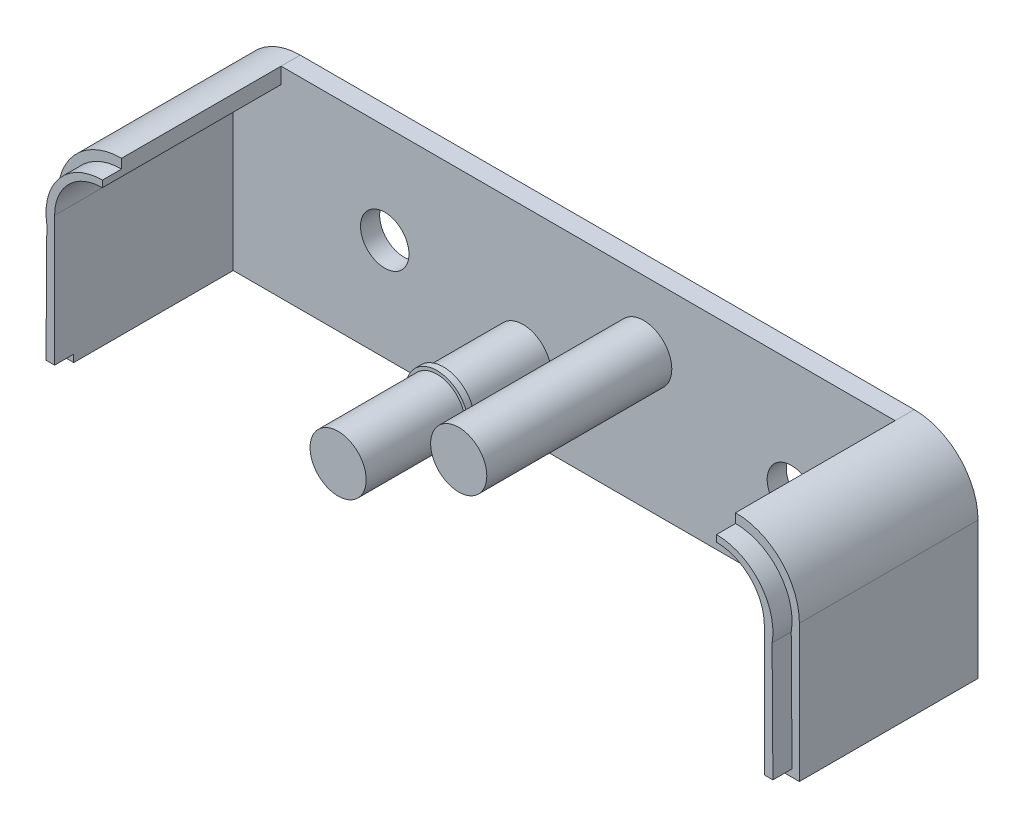
ISO-10303-21;
HEADER;
FILE_DESCRIPTION(('STEP AP214'),'2;1');
FILE_NAME('part.step','',(''),(''),'','','');
FILE_SCHEMA(('AUTOMOTIVE_DESIGN { 1 0 10303 214 1 1 1 1 }'));
ENDSEC;
DATA;
#1=APPLICATION_CONTEXT('core data for automotive mechanical design processes');
#2=APPLICATION_PROTOCOL_DEFINITION('international standard','automotive_design',2000,#1);
#3=PRODUCT_CONTEXT('',#1,'mechanical');
#4=PRODUCT('Part','Part','',(#3));
#5=PRODUCT_RELATED_PRODUCT_CATEGORY('part','',(#4));
#6=PRODUCT_DEFINITION_FORMATION('','',#4);
#7=PRODUCT_DEFINITION_CONTEXT('part definition',#1,'design');
#8=PRODUCT_DEFINITION('design','',#6,#7);
#9=PRODUCT_DEFINITION_SHAPE('','',#8);
#10=(LENGTH_UNIT() NAMED_UNIT(*) SI_UNIT(.MILLI.,.METRE.));
#11=(NAMED_UNIT(*) PLANE_ANGLE_UNIT() SI_UNIT($,.RADIAN.));
#12=(NAMED_UNIT(*) SI_UNIT($,.STERADIAN.) SOLID_ANGLE_UNIT());
#13=UNCERTAINTY_MEASURE_WITH_UNIT(LENGTH_MEASURE(1.E-05),#10,'distance_accuracy_value','');
#14=(GEOMETRIC_REPRESENTATION_CONTEXT(3) GLOBAL_UNCERTAINTY_ASSIGNED_CONTEXT((#13)) GLOBAL_UNIT_ASSIGNED_CONTEXT((#10,
#11,#12)) REPRESENTATION_CONTEXT('',''));
#15=CARTESIAN_POINT('',(0.,0.,0.));
#16=DIRECTION('',(0.,0.,1.));
#17=DIRECTION('',(1.,0.,0.));
#18=AXIS2_PLACEMENT_3D('',#15,#16,#17);
#19=CARTESIAN_POINT('',(-10.185,-4.75,28.));
#20=DIRECTION('',(0.,0.,-1.));
#21=DIRECTION('',(-1.,0.,0.));
#22=AXIS2_PLACEMENT_3D('',#19,#20,#21);
#23=CYLINDRICAL_SURFACE('',#22,4.4);
#24=CARTESIAN_POINT('',(-10.185,-4.75,3.));
#25=DIRECTION('',(0.,0.,1.));
#26=DIRECTION('',(1.,0.,0.));
#27=AXIS2_PLACEMENT_3D('',#24,#25,#26);
#28=CIRCLE('',#27,4.4);
#29=CARTESIAN_POINT('',(-5.785,-4.75,3.));
#30=VERTEX_POINT('',#29);
#31=EDGE_CURVE('E267',#30,#30,#28,.T.);
#32=ORIENTED_EDGE('',*,*,#31,.T.);
#33=EDGE_LOOP('',(#32));
#34=FACE_BOUND('',#33,.T.);
#35=CARTESIAN_POINT('',(-10.185,-4.75,15.5));
#36=DIRECTION('',(0.,0.,1.));
#37=DIRECTION('',(1.,0.,0.));
#38=AXIS2_PLACEMENT_3D('',#35,#36,#37);
#39=CIRCLE('',#38,4.4);
#40=CARTESIAN_POINT('',(-5.785,-4.75,15.5));
#41=VERTEX_POINT('',#40);
#42=EDGE_CURVE('E11',#41,#41,#39,.T.);
#43=ORIENTED_EDGE('',*,*,#42,.F.);
#44=EDGE_LOOP('',(#43));
#45=FACE_BOUND('',#44,.T.);
#46=ADVANCED_FACE('F41',(#34,#45),#23,.T.);
#47=CARTESIAN_POINT('',(0.,0.,28.));
#48=DIRECTION('',(0.,0.,1.));
#49=DIRECTION('',(1.,0.,0.));
#50=AXIS2_PLACEMENT_3D('',#47,#48,#49);
#51=PLANE('',#50);
#52=DIRECTION('',(-0.00691231713860875,0.999976109650513,0.));
#53=VECTOR('',#52,1.);
#54=CARTESIAN_POINT('',(56.8468788897479,3.93474700667868,28.));
#55=LINE('',#54,#53);
#56=CARTESIAN_POINT('',(56.975,-14.6,28.));
#57=VERTEX_POINT('',#56);
#58=CARTESIAN_POINT('',(56.8468788897479,3.93474700667868,28.));
#59=VERTEX_POINT('',#58);
#60=EDGE_CURVE('E251',#57,#59,#55,.T.);
#61=ORIENTED_EDGE('',*,*,#60,.F.);
#62=DIRECTION('',(1.,0.,0.));
#63=VECTOR('',#62,1.);
#64=CARTESIAN_POINT('',(55.625,-14.6,28.));
#65=LINE('',#64,#63);
#66=CARTESIAN_POINT('',(55.625,-14.6,28.));
#67=VERTEX_POINT('',#66);
#68=EDGE_CURVE('E228',#67,#57,#65,.T.);
#69=ORIENTED_EDGE('',*,*,#68,.F.);
#70=DIRECTION('',(0.,1.,0.));
#71=VECTOR('',#70,1.);
#72=CARTESIAN_POINT('',(55.625,0.,28.));
#73=LINE('',#72,#71);
#74=CARTESIAN_POINT('',(55.625,-15.75,28.));
#75=VERTEX_POINT('',#74);
#76=EDGE_CURVE('E272',#75,#67,#73,.T.);
#77=ORIENTED_EDGE('',*,*,#76,.F.);
#78=DIRECTION('',(1.,0.,0.));
#79=VECTOR('',#78,1.);
#80=CARTESIAN_POINT('',(0.,-15.75,28.));
#81=LINE('',#80,#79);
#82=CARTESIAN_POINT('',(58.125,-15.75,28.));
#83=VERTEX_POINT('',#82);
#84=EDGE_CURVE('E275',#75,#83,#81,.T.);
#85=ORIENTED_EDGE('',*,*,#84,.T.);
#86=DIRECTION('',(0.,1.,0.));
#87=VECTOR('',#86,1.);
#88=CARTESIAN_POINT('',(58.125,0.,28.));
#89=LINE('',#88,#87);
#90=CARTESIAN_POINT('',(58.125,5.75,28.));
#91=VERTEX_POINT('',#90);
#92=EDGE_CURVE('E279',#83,#91,#89,.T.);
#93=ORIENTED_EDGE('',*,*,#92,.T.);
#94=CARTESIAN_POINT('',(48.125,5.75,28.));
#95=DIRECTION('',(0.,0.,1.));
#96=DIRECTION('',(1.,0.,0.));
#97=AXIS2_PLACEMENT_3D('',#94,#95,#96);
#98=CIRCLE('',#97,10.);
#99=CARTESIAN_POINT('',(48.125,15.75,28.));
#100=VERTEX_POINT('',#99);
#101=EDGE_CURVE('E282',#91,#100,#98,.T.);
#102=ORIENTED_EDGE('',*,*,#101,.T.);
#103=DIRECTION('',(0.,1.,0.));
#104=VECTOR('',#103,1.);
#105=CARTESIAN_POINT('',(48.125,0.,28.));
#106=LINE('',#105,#104);
#107=CARTESIAN_POINT('',(48.125,14.2851898188413,28.));
#108=VERTEX_POINT('',#107);
#109=EDGE_CURVE('E285',#108,#100,#106,.T.);
#110=ORIENTED_EDGE('',*,*,#109,.F.);
#111=CARTESIAN_POINT('',(48.125,5.43518981884131,28.));
#112=DIRECTION('',(0.,0.,1.));
#113=DIRECTION('',(-1.,0.,0.));
#114=AXIS2_PLACEMENT_3D('',#111,#112,#113);
#115=CIRCLE('',#114,8.85);
#116=EDGE_CURVE('E249',#59,#108,#115,.T.);
#117=ORIENTED_EDGE('',*,*,#116,.F.);
#118=EDGE_LOOP('',(#61,#69,#77,#85,#93,#102,#110,#117));
#119=FACE_BOUND('',#118,.T.);
#120=ADVANCED_FACE('F407',(#119),#51,.T.);
#121=CARTESIAN_POINT('',(0.,0.,28.));
#122=DIRECTION('',(0.,0.,1.));
#123=DIRECTION('',(1.,0.,0.));
#124=AXIS2_PLACEMENT_3D('',#121,#122,#123);
#125=PLANE('',#124);
#126=DIRECTION('',(-0.006912317138608,-0.999976109650513,0.));
#127=VECTOR('',#126,1.);
#128=CARTESIAN_POINT('',(-56.8468788897479,3.93474700667866,28.));
#129=LINE('',#128,#127);
#130=CARTESIAN_POINT('',(-56.8468788897479,3.93474700667866,28.));
#131=VERTEX_POINT('',#130);
#132=CARTESIAN_POINT('',(-56.975,-14.6,28.));
#133=VERTEX_POINT('',#132);
#134=EDGE_CURVE('E214',#131,#133,#129,.T.);
#135=ORIENTED_EDGE('',*,*,#134,.F.);
#136=CARTESIAN_POINT('',(-48.125,5.4351898188413,28.));
#137=DIRECTION('',(0.,0.,1.));
#138=DIRECTION('',(1.,0.,0.));
#139=AXIS2_PLACEMENT_3D('',#136,#137,#138);
#140=CIRCLE('',#139,8.85);
#141=CARTESIAN_POINT('',(-48.125,14.2851898188413,28.));
#142=VERTEX_POINT('',#141);
#143=EDGE_CURVE('E226',#142,#131,#140,.T.);
#144=ORIENTED_EDGE('',*,*,#143,.F.);
#145=DIRECTION('',(0.,1.,0.));
#146=VECTOR('',#145,1.);
#147=CARTESIAN_POINT('',(-48.125,0.,28.));
#148=LINE('',#147,#146);
#149=CARTESIAN_POINT('',(-48.125,15.75,28.));
#150=VERTEX_POINT('',#149);
#151=EDGE_CURVE('E302',#142,#150,#148,.T.);
#152=ORIENTED_EDGE('',*,*,#151,.T.);
#153=CARTESIAN_POINT('',(-48.125,5.75,28.));
#154=DIRECTION('',(0.,0.,1.));
#155=DIRECTION('',(1.,0.,0.));
#156=AXIS2_PLACEMENT_3D('',#153,#154,#155);
#157=CIRCLE('',#156,10.);
#158=CARTESIAN_POINT('',(-58.125,5.75,28.));
#159=VERTEX_POINT('',#158);
#160=EDGE_CURVE('E304',#150,#159,#157,.T.);
#161=ORIENTED_EDGE('',*,*,#160,.T.);
#162=DIRECTION('',(0.,-1.,0.));
#163=VECTOR('',#162,1.);
#164=CARTESIAN_POINT('',(-58.125,0.,28.));
#165=LINE('',#164,#163);
#166=CARTESIAN_POINT('',(-58.125,-15.75,28.));
#167=VERTEX_POINT('',#166);
#168=EDGE_CURVE('E308',#159,#167,#165,.T.);
#169=ORIENTED_EDGE('',*,*,#168,.T.);
#170=DIRECTION('',(1.,0.,0.));
#171=VECTOR('',#170,1.);
#172=CARTESIAN_POINT('',(0.,-15.75,28.));
#173=LINE('',#172,#171);
#174=CARTESIAN_POINT('',(-55.625,-15.75,28.));
#175=VERTEX_POINT('',#174);
#176=EDGE_CURVE('E311',#167,#175,#173,.T.);
#177=ORIENTED_EDGE('',*,*,#176,.T.);
#178=DIRECTION('',(0.,-1.,0.));
#179=VECTOR('',#178,1.);
#180=CARTESIAN_POINT('',(-55.625,0.,28.));
#181=LINE('',#180,#179);
#182=CARTESIAN_POINT('',(-55.625,-14.6,28.));
#183=VERTEX_POINT('',#182);
#184=EDGE_CURVE('E314',#183,#175,#181,.T.);
#185=ORIENTED_EDGE('',*,*,#184,.F.);
#186=DIRECTION('',(1.,0.,0.));
#187=VECTOR('',#186,1.);
#188=CARTESIAN_POINT('',(-55.625,-14.6,28.));
#189=LINE('',#188,#187);
#190=EDGE_CURVE('E212',#133,#183,#189,.T.);
#191=ORIENTED_EDGE('',*,*,#190,.F.);
#192=EDGE_LOOP('',(#135,#144,#152,#161,#169,#177,#185,#191));
#193=FACE_BOUND('',#192,.T.);
#194=ADVANCED_FACE('F422',(#193),#125,.T.);
#195=CARTESIAN_POINT('',(8.72499999999998,5.25,28.));
#196=DIRECTION('',(0.,0.,-1.));
#197=DIRECTION('',(-1.,0.,0.));
#198=AXIS2_PLACEMENT_3D('',#195,#196,#197);
#199=CYLINDRICAL_SURFACE('',#198,4.39999999999999);
#200=CARTESIAN_POINT('',(8.72499999999998,5.25,3.));
#201=DIRECTION('',(0.,0.,1.));
#202=DIRECTION('',(1.,0.,0.));
#203=AXIS2_PLACEMENT_3D('',#200,#201,#202);
#204=CIRCLE('',#203,4.39999999999999);
#205=CARTESIAN_POINT('',(13.125,5.25,3.));
#206=VERTEX_POINT('',#205);
#207=EDGE_CURVE('E270',#206,#206,#204,.T.);
#208=ORIENTED_EDGE('',*,*,#207,.T.);
#209=EDGE_LOOP('',(#208));
#210=FACE_BOUND('',#209,.T.);
#211=CARTESIAN_POINT('',(8.72499999999998,5.25,32.));
#212=DIRECTION('',(0.,0.,1.));
#213=DIRECTION('',(1.,0.,0.));
#214=AXIS2_PLACEMENT_3D('',#211,#212,#213);
#215=CIRCLE('',#214,4.39999999999999);
#216=CARTESIAN_POINT('',(13.125,5.25,32.));
#217=VERTEX_POINT('',#216);
#218=EDGE_CURVE('E217',#217,#217,#215,.T.);
#219=ORIENTED_EDGE('',*,*,#218,.F.);
#220=EDGE_LOOP('',(#219));
#221=FACE_BOUND('',#220,.T.);
#222=ADVANCED_FACE('F538',(#210,#221),#199,.T.);
#223=CARTESIAN_POINT('',(-48.125,5.75,3.));
#224=DIRECTION('',(0.,0.,1.));
#225=DIRECTION('',(1.,0.,0.));
#226=AXIS2_PLACEMENT_3D('',#223,#224,#225);
#227=PLANE('',#226);
#228=ORIENTED_EDGE('',*,*,#31,.F.);
#229=EDGE_LOOP('',(#228));
#230=FACE_BOUND('',#229,.T.);
#231=ORIENTED_EDGE('',*,*,#207,.F.);
#232=EDGE_LOOP('',(#231));
#233=FACE_BOUND('',#232,.T.);
#234=CARTESIAN_POINT('',(31.875,-2.25,3.));
#235=DIRECTION('',(0.,0.,1.));
#236=DIRECTION('',(1.,0.,0.));
#237=AXIS2_PLACEMENT_3D('',#234,#235,#236);
#238=CIRCLE('',#237,3.8);
#239=CARTESIAN_POINT('',(35.675,-2.25,3.));
#240=VERTEX_POINT('',#239);
#241=EDGE_CURVE('E336',#240,#240,#238,.T.);
#242=ORIENTED_EDGE('',*,*,#241,.F.);
#243=EDGE_LOOP('',(#242));
#244=FACE_BOUND('',#243,.T.);
#245=CARTESIAN_POINT('',(-48.125,5.75,3.));
#246=DIRECTION('',(0.,0.,1.));
#247=DIRECTION('',(1.,0.,0.));
#248=AXIS2_PLACEMENT_3D('',#245,#246,#247);
#249=CIRCLE('',#248,7.5);
#250=CARTESIAN_POINT('',(-48.125,13.25,3.));
#251=VERTEX_POINT('',#250);
#252=CARTESIAN_POINT('',(-55.625,5.75,3.));
#253=VERTEX_POINT('',#252);
#254=EDGE_CURVE('E194',#251,#253,#249,.T.);
#255=ORIENTED_EDGE('',*,*,#254,.T.);
#256=DIRECTION('',(0.,-1.,0.));
#257=VECTOR('',#256,1.);
#258=CARTESIAN_POINT('',(-55.625,0.,3.));
#259=LINE('',#258,#257);
#260=CARTESIAN_POINT('',(-55.625,-15.75,3.));
#261=VERTEX_POINT('',#260);
#262=EDGE_CURVE('E305',#253,#261,#259,.T.);
#263=ORIENTED_EDGE('',*,*,#262,.T.);
#264=DIRECTION('',(1.,0.,0.));
#265=VECTOR('',#264,1.);
#266=CARTESIAN_POINT('',(-58.125,-15.75,3.));
#267=LINE('',#266,#265);
#268=CARTESIAN_POINT('',(55.625,-15.75,3.));
#269=VERTEX_POINT('',#268);
#270=EDGE_CURVE('E345',#261,#269,#267,.T.);
#271=ORIENTED_EDGE('',*,*,#270,.T.);
#272=DIRECTION('',(0.,1.,0.));
#273=VECTOR('',#272,1.);
#274=CARTESIAN_POINT('',(55.625,0.,3.));
#275=LINE('',#274,#273);
#276=CARTESIAN_POINT('',(55.625,5.75,3.));
#277=VERTEX_POINT('',#276);
#278=EDGE_CURVE('E290',#269,#277,#275,.T.);
#279=ORIENTED_EDGE('',*,*,#278,.T.);
#280=CARTESIAN_POINT('',(48.125,5.75,3.));
#281=DIRECTION('',(0.,0.,1.));
#282=DIRECTION('',(1.,0.,0.));
#283=AXIS2_PLACEMENT_3D('',#280,#281,#282);
#284=CIRCLE('',#283,7.5);
#285=CARTESIAN_POINT('',(48.125,13.25,3.));
#286=VERTEX_POINT('',#285);
#287=EDGE_CURVE('E197',#277,#286,#284,.T.);
#288=ORIENTED_EDGE('',*,*,#287,.T.);
#289=DIRECTION('',(0.,1.,0.));
#290=VECTOR('',#289,1.);
#291=CARTESIAN_POINT('',(48.125,0.,3.));
#292=LINE('',#291,#290);
#293=CARTESIAN_POINT('',(48.125,15.75,3.));
#294=VERTEX_POINT('',#293);
#295=EDGE_CURVE('E276',#286,#294,#292,.T.);
#296=ORIENTED_EDGE('',*,*,#295,.T.);
#297=DIRECTION('',(-1.,0.,0.));
#298=VECTOR('',#297,1.);
#299=CARTESIAN_POINT('',(-48.125,15.75,3.));
#300=LINE('',#299,#298);
#301=CARTESIAN_POINT('',(-48.125,15.75,3.));
#302=VERTEX_POINT('',#301);
#303=EDGE_CURVE('E342',#294,#302,#300,.T.);
#304=ORIENTED_EDGE('',*,*,#303,.T.);
#305=DIRECTION('',(0.,1.,0.));
#306=VECTOR('',#305,1.);
#307=CARTESIAN_POINT('',(-48.125,0.,3.));
#308=LINE('',#307,#306);
#309=EDGE_CURVE('E318',#251,#302,#308,.T.);
#310=ORIENTED_EDGE('',*,*,#309,.F.);
#311=EDGE_LOOP('',(#255,#263,#271,#279,#288,#296,#304,#310));
#312=FACE_BOUND('',#311,.T.);
#313=CARTESIAN_POINT('',(-31.875,0.249999999999998,3.));
#314=DIRECTION('',(0.,0.,1.));
#315=DIRECTION('',(1.,0.,0.));
#316=AXIS2_PLACEMENT_3D('',#313,#314,#315);
#317=CIRCLE('',#316,3.8);
#318=CARTESIAN_POINT('',(-28.075,0.249999999999998,3.));
#319=VERTEX_POINT('',#318);
#320=EDGE_CURVE('E330',#319,#319,#317,.T.);
#321=ORIENTED_EDGE('',*,*,#320,.F.);
#322=EDGE_LOOP('',(#321));
#323=FACE_BOUND('',#322,.T.);
#324=ADVANCED_FACE('F399',(#230,#233,#244,#312,#323),#227,.T.);
#325=CARTESIAN_POINT('',(-48.125,5.75,0.));
#326=DIRECTION('',(0.,0.,1.));
#327=DIRECTION('',(1.,0.,0.));
#328=AXIS2_PLACEMENT_3D('',#325,#326,#327);
#329=PLANE('',#328);
#330=DIRECTION('',(0.,1.,0.));
#331=VECTOR('',#330,1.);
#332=CARTESIAN_POINT('',(58.125,5.75,0.));
#333=LINE('',#332,#331);
#334=CARTESIAN_POINT('',(58.125,-15.75,0.));
#335=VERTEX_POINT('',#334);
#336=CARTESIAN_POINT('',(58.125,5.75,0.));
#337=VERTEX_POINT('',#336);
#338=EDGE_CURVE('E339',#335,#337,#333,.T.);
#339=ORIENTED_EDGE('',*,*,#338,.F.);
#340=DIRECTION('',(1.,0.,0.));
#341=VECTOR('',#340,1.);
#342=CARTESIAN_POINT('',(-58.125,-15.75,0.));
#343=LINE('',#342,#341);
#344=CARTESIAN_POINT('',(-58.125,-15.75,0.));
#345=VERTEX_POINT('',#344);
#346=EDGE_CURVE('E346',#345,#335,#343,.T.);
#347=ORIENTED_EDGE('',*,*,#346,.F.);
#348=DIRECTION('',(0.,-1.,0.));
#349=VECTOR('',#348,1.);
#350=CARTESIAN_POINT('',(-58.125,5.75,0.));
#351=LINE('',#350,#349);
#352=CARTESIAN_POINT('',(-58.125,5.75,0.));
#353=VERTEX_POINT('',#352);
#354=EDGE_CURVE('E358',#353,#345,#351,.T.);
#355=ORIENTED_EDGE('',*,*,#354,.F.);
#356=CARTESIAN_POINT('',(-48.125,5.75,0.));
#357=DIRECTION('',(0.,0.,1.));
#358=DIRECTION('',(1.,0.,0.));
#359=AXIS2_PLACEMENT_3D('',#356,#357,#358);
#360=CIRCLE('',#359,10.);
#361=CARTESIAN_POINT('',(-48.125,15.75,0.));
#362=VERTEX_POINT('',#361);
#363=EDGE_CURVE('E356',#362,#353,#360,.T.);
#364=ORIENTED_EDGE('',*,*,#363,.F.);
#365=DIRECTION('',(-1.,0.,0.));
#366=VECTOR('',#365,1.);
#367=CARTESIAN_POINT('',(-48.125,15.75,0.));
#368=LINE('',#367,#366);
#369=CARTESIAN_POINT('',(48.125,15.75,0.));
#370=VERTEX_POINT('',#369);
#371=EDGE_CURVE('E354',#370,#362,#368,.T.);
#372=ORIENTED_EDGE('',*,*,#371,.F.);
#373=CARTESIAN_POINT('',(48.125,5.75,0.));
#374=DIRECTION('',(0.,0.,1.));
#375=DIRECTION('',(-1.,0.,0.));
#376=AXIS2_PLACEMENT_3D('',#373,#374,#375);
#377=CIRCLE('',#376,10.);
#378=EDGE_CURVE('E352',#337,#370,#377,.T.);
#379=ORIENTED_EDGE('',*,*,#378,.F.);
#380=EDGE_LOOP('',(#339,#347,#355,#364,#372,#379));
#381=FACE_BOUND('',#380,.T.);
#382=CARTESIAN_POINT('',(31.875,-2.25,0.));
#383=DIRECTION('',(0.,0.,1.));
#384=DIRECTION('',(1.,0.,0.));
#385=AXIS2_PLACEMENT_3D('',#382,#383,#384);
#386=CIRCLE('',#385,3.8);
#387=CARTESIAN_POINT('',(35.675,-2.25,0.));
#388=VERTEX_POINT('',#387);
#389=EDGE_CURVE('E333',#388,#388,#386,.T.);
#390=ORIENTED_EDGE('',*,*,#389,.T.);
#391=EDGE_LOOP('',(#390));
#392=FACE_BOUND('',#391,.T.);
#393=CARTESIAN_POINT('',(-31.875,0.249999999999998,0.));
#394=DIRECTION('',(0.,0.,1.));
#395=DIRECTION('',(1.,0.,0.));
#396=AXIS2_PLACEMENT_3D('',#393,#394,#395);
#397=CIRCLE('',#396,3.8);
#398=CARTESIAN_POINT('',(-28.075,0.249999999999998,0.));
#399=VERTEX_POINT('',#398);
#400=EDGE_CURVE('E329',#399,#399,#397,.T.);
#401=ORIENTED_EDGE('',*,*,#400,.T.);
#402=EDGE_LOOP('',(#401));
#403=FACE_BOUND('',#402,.T.);
#404=ADVANCED_FACE('F386',(#381,#392,#403),#329,.F.);
#405=CARTESIAN_POINT('',(58.125,5.75,3.));
#406=DIRECTION('',(-1.,0.,0.));
#407=DIRECTION('',(0.,-1.,0.));
#408=AXIS2_PLACEMENT_3D('',#405,#406,#407);
#409=PLANE('',#408);
#410=ORIENTED_EDGE('',*,*,#338,.T.);
#411=DIRECTION('',(0.,0.,-1.));
#412=VECTOR('',#411,1.);
#413=CARTESIAN_POINT('',(58.125,5.75,3.));
#414=LINE('',#413,#412);
#415=EDGE_CURVE('E50',#91,#337,#414,.T.);
#416=ORIENTED_EDGE('',*,*,#415,.F.);
#417=ORIENTED_EDGE('',*,*,#92,.F.);
#418=DIRECTION('',(0.,0.,-1.));
#419=VECTOR('',#418,1.);
#420=CARTESIAN_POINT('',(58.125,-15.75,3.));
#421=LINE('',#420,#419);
#422=EDGE_CURVE('E349',#83,#335,#421,.T.);
#423=ORIENTED_EDGE('',*,*,#422,.T.);
#424=EDGE_LOOP('',(#410,#416,#417,#423));
#425=FACE_BOUND('',#424,.T.);
#426=ADVANCED_FACE('F43',(#425),#409,.F.);
#427=CARTESIAN_POINT('',(48.125,5.75,3.));
#428=DIRECTION('',(0.,0.,-1.));
#429=DIRECTION('',(-1.,0.,0.));
#430=AXIS2_PLACEMENT_3D('',#427,#428,#429);
#431=CYLINDRICAL_SURFACE('',#430,10.);
#432=ORIENTED_EDGE('',*,*,#378,.T.);
#433=DIRECTION('',(0.,0.,-1.));
#434=VECTOR('',#433,1.);
#435=CARTESIAN_POINT('',(48.125,15.75,3.));
#436=LINE('',#435,#434);
#437=EDGE_CURVE('E372',#294,#370,#436,.T.);
#438=ORIENTED_EDGE('',*,*,#437,.F.);
#439=DIRECTION('',(0.,0.,-1.));
#440=VECTOR('',#439,1.);
#441=CARTESIAN_POINT('',(48.125,15.75,28.));
#442=LINE('',#441,#440);
#443=EDGE_CURVE('E296',#100,#294,#442,.T.);
#444=ORIENTED_EDGE('',*,*,#443,.F.);
#445=ORIENTED_EDGE('',*,*,#101,.F.);
#446=ORIENTED_EDGE('',*,*,#415,.T.);
#447=EDGE_LOOP('',(#432,#438,#444,#445,#446));
#448=FACE_BOUND('',#447,.T.);
#449=ADVANCED_FACE('F378',(#448),#431,.T.);
#450=CARTESIAN_POINT('',(-48.125,15.75,3.));
#451=DIRECTION('',(0.,-1.,0.));
#452=DIRECTION('',(1.,0.,0.));
#453=AXIS2_PLACEMENT_3D('',#450,#451,#452);
#454=PLANE('',#453);
#455=ORIENTED_EDGE('',*,*,#371,.T.);
#456=DIRECTION('',(0.,0.,-1.));
#457=VECTOR('',#456,1.);
#458=CARTESIAN_POINT('',(-48.125,15.75,3.));
#459=LINE('',#458,#457);
#460=EDGE_CURVE('E369',#302,#362,#459,.T.);
#461=ORIENTED_EDGE('',*,*,#460,.F.);
#462=ORIENTED_EDGE('',*,*,#303,.F.);
#463=ORIENTED_EDGE('',*,*,#437,.T.);
#464=EDGE_LOOP('',(#455,#461,#462,#463));
#465=FACE_BOUND('',#464,.T.);
#466=ADVANCED_FACE('F392',(#465),#454,.F.);
#467=CARTESIAN_POINT('',(-48.125,5.75,3.));
#468=DIRECTION('',(0.,0.,-1.));
#469=DIRECTION('',(-1.,0.,0.));
#470=AXIS2_PLACEMENT_3D('',#467,#468,#469);
#471=CYLINDRICAL_SURFACE('',#470,10.);
#472=ORIENTED_EDGE('',*,*,#363,.T.);
#473=DIRECTION('',(0.,0.,-1.));
#474=VECTOR('',#473,1.);
#475=CARTESIAN_POINT('',(-58.125,5.75,3.));
#476=LINE('',#475,#474);
#477=EDGE_CURVE('E366',#159,#353,#476,.T.);
#478=ORIENTED_EDGE('',*,*,#477,.F.);
#479=ORIENTED_EDGE('',*,*,#160,.F.);
#480=DIRECTION('',(0.,0.,-1.));
#481=VECTOR('',#480,1.);
#482=CARTESIAN_POINT('',(-48.125,15.75,28.));
#483=LINE('',#482,#481);
#484=EDGE_CURVE('E198',#150,#302,#483,.T.);
#485=ORIENTED_EDGE('',*,*,#484,.T.);
#486=ORIENTED_EDGE('',*,*,#460,.T.);
#487=EDGE_LOOP('',(#472,#478,#479,#485,#486));
#488=FACE_BOUND('',#487,.T.);
#489=ADVANCED_FACE('F395',(#488),#471,.T.);
#490=CARTESIAN_POINT('',(-58.125,5.75,3.));
#491=DIRECTION('',(1.,0.,0.));
#492=DIRECTION('',(0.,0.,-1.));
#493=AXIS2_PLACEMENT_3D('',#490,#491,#492);
#494=PLANE('',#493);
#495=ORIENTED_EDGE('',*,*,#354,.T.);
#496=DIRECTION('',(0.,0.,-1.));
#497=VECTOR('',#496,1.);
#498=CARTESIAN_POINT('',(-58.125,-15.75,3.));
#499=LINE('',#498,#497);
#500=EDGE_CURVE('E363',#167,#345,#499,.T.);
#501=ORIENTED_EDGE('',*,*,#500,.F.);
#502=ORIENTED_EDGE('',*,*,#168,.F.);
#503=ORIENTED_EDGE('',*,*,#477,.T.);
#504=EDGE_LOOP('',(#495,#501,#502,#503));
#505=FACE_BOUND('',#504,.T.);
#506=ADVANCED_FACE('F419',(#505),#494,.F.);
#507=CARTESIAN_POINT('',(-58.125,-15.75,3.));
#508=DIRECTION('',(0.,1.,0.));
#509=DIRECTION('',(0.,0.,1.));
#510=AXIS2_PLACEMENT_3D('',#507,#508,#509);
#511=PLANE('',#510);
#512=ORIENTED_EDGE('',*,*,#346,.T.);
#513=ORIENTED_EDGE('',*,*,#422,.F.);
#514=ORIENTED_EDGE('',*,*,#84,.F.);
#515=DIRECTION('',(0.,0.,-1.));
#516=VECTOR('',#515,1.);
#517=CARTESIAN_POINT('',(55.625,-15.75,28.));
#518=LINE('',#517,#516);
#519=EDGE_CURVE('E298',#75,#269,#518,.T.);
#520=ORIENTED_EDGE('',*,*,#519,.T.);
#521=ORIENTED_EDGE('',*,*,#270,.F.);
#522=DIRECTION('',(0.,0.,-1.));
#523=VECTOR('',#522,1.);
#524=CARTESIAN_POINT('',(-55.625,-15.75,28.));
#525=LINE('',#524,#523);
#526=EDGE_CURVE('E322',#175,#261,#525,.T.);
#527=ORIENTED_EDGE('',*,*,#526,.F.);
#528=ORIENTED_EDGE('',*,*,#176,.F.);
#529=ORIENTED_EDGE('',*,*,#500,.T.);
#530=EDGE_LOOP('',(#512,#513,#514,#520,#521,#527,#528,#529));
#531=FACE_BOUND('',#530,.T.);
#532=ADVANCED_FACE('F412',(#531),#511,.F.);
#533=CARTESIAN_POINT('',(31.875,-2.25,3.));
#534=DIRECTION('',(0.,0.,-1.));
#535=DIRECTION('',(-1.,0.,0.));
#536=AXIS2_PLACEMENT_3D('',#533,#534,#535);
#537=CYLINDRICAL_SURFACE('',#536,3.8);
#538=ORIENTED_EDGE('',*,*,#241,.T.);
#539=EDGE_LOOP('',(#538));
#540=FACE_BOUND('',#539,.T.);
#541=ORIENTED_EDGE('',*,*,#389,.F.);
#542=EDGE_LOOP('',(#541));
#543=FACE_BOUND('',#542,.T.);
#544=ADVANCED_FACE('F545',(#540,#543),#537,.F.);
#545=CARTESIAN_POINT('',(-31.875,0.249999999999998,3.));
#546=DIRECTION('',(0.,0.,-1.));
#547=DIRECTION('',(-1.,0.,0.));
#548=AXIS2_PLACEMENT_3D('',#545,#546,#547);
#549=CYLINDRICAL_SURFACE('',#548,3.8);
#550=ORIENTED_EDGE('',*,*,#320,.T.);
#551=EDGE_LOOP('',(#550));
#552=FACE_BOUND('',#551,.T.);
#553=ORIENTED_EDGE('',*,*,#400,.F.);
#554=EDGE_LOOP('',(#553));
#555=FACE_BOUND('',#554,.T.);
#556=ADVANCED_FACE('F542',(#552,#555),#549,.F.);
#557=CARTESIAN_POINT('',(48.125,5.75,28.));
#558=DIRECTION('',(0.,0.,-1.));
#559=DIRECTION('',(-1.,0.,0.));
#560=AXIS2_PLACEMENT_3D('',#557,#558,#559);
#561=CYLINDRICAL_SURFACE('',#560,7.5);
#562=ORIENTED_EDGE('',*,*,#287,.F.);
#563=DIRECTION('',(0.,0.,-1.));
#564=VECTOR('',#563,1.);
#565=CARTESIAN_POINT('',(55.625,5.75,28.));
#566=LINE('',#565,#564);
#567=CARTESIAN_POINT('',(55.625,5.75000000000001,31.));
#568=VERTEX_POINT('',#567);
#569=EDGE_CURVE('E271',#568,#277,#566,.T.);
#570=ORIENTED_EDGE('',*,*,#569,.F.);
#571=CARTESIAN_POINT('',(48.125,5.75000000000001,31.));
#572=DIRECTION('',(0.,0.,-1.));
#573=DIRECTION('',(-1.,0.,0.));
#574=AXIS2_PLACEMENT_3D('',#571,#572,#573);
#575=CIRCLE('',#574,7.5);
#576=CARTESIAN_POINT('',(48.125,13.25,31.));
#577=VERTEX_POINT('',#576);
#578=EDGE_CURVE('E252',#577,#568,#575,.T.);
#579=ORIENTED_EDGE('',*,*,#578,.F.);
#580=DIRECTION('',(0.,0.,-1.));
#581=VECTOR('',#580,1.);
#582=CARTESIAN_POINT('',(48.125,13.25,28.));
#583=LINE('',#582,#581);
#584=EDGE_CURVE('E287',#577,#286,#583,.T.);
#585=ORIENTED_EDGE('',*,*,#584,.T.);
#586=EDGE_LOOP('',(#562,#570,#579,#585));
#587=FACE_BOUND('',#586,.T.);
#588=ADVANCED_FACE('F444',(#587),#561,.F.);
#589=CARTESIAN_POINT('',(55.625,0.,28.));
#590=DIRECTION('',(-1.,0.,0.));
#591=DIRECTION('',(0.,-1.,0.));
#592=AXIS2_PLACEMENT_3D('',#589,#590,#591);
#593=PLANE('',#592);
#594=ORIENTED_EDGE('',*,*,#278,.F.);
#595=ORIENTED_EDGE('',*,*,#519,.F.);
#596=ORIENTED_EDGE('',*,*,#76,.T.);
#597=DIRECTION('',(0.,0.,-1.));
#598=VECTOR('',#597,1.);
#599=CARTESIAN_POINT('',(55.625,-14.6,31.));
#600=LINE('',#599,#598);
#601=CARTESIAN_POINT('',(55.625,-14.6,31.));
#602=VERTEX_POINT('',#601);
#603=EDGE_CURVE('E238',#602,#67,#600,.T.);
#604=ORIENTED_EDGE('',*,*,#603,.F.);
#605=DIRECTION('',(0.,-1.,0.));
#606=VECTOR('',#605,1.);
#607=CARTESIAN_POINT('',(55.625,-14.6,31.));
#608=LINE('',#607,#606);
#609=EDGE_CURVE('E263',#568,#602,#608,.T.);
#610=ORIENTED_EDGE('',*,*,#609,.F.);
#611=ORIENTED_EDGE('',*,*,#569,.T.);
#612=EDGE_LOOP('',(#594,#595,#596,#604,#610,#611));
#613=FACE_BOUND('',#612,.T.);
#614=ADVANCED_FACE('F439',(#613),#593,.T.);
#615=CARTESIAN_POINT('',(48.125,0.,28.));
#616=DIRECTION('',(-1.,0.,0.));
#617=DIRECTION('',(0.,0.,1.));
#618=AXIS2_PLACEMENT_3D('',#615,#616,#617);
#619=PLANE('',#618);
#620=ORIENTED_EDGE('',*,*,#295,.F.);
#621=ORIENTED_EDGE('',*,*,#584,.F.);
#622=DIRECTION('',(0.,-1.,0.));
#623=VECTOR('',#622,1.);
#624=CARTESIAN_POINT('',(48.125,13.25,31.));
#625=LINE('',#624,#623);
#626=CARTESIAN_POINT('',(48.125,14.2851898188413,31.));
#627=VERTEX_POINT('',#626);
#628=EDGE_CURVE('E248',#627,#577,#625,.T.);
#629=ORIENTED_EDGE('',*,*,#628,.F.);
#630=DIRECTION('',(0.,0.,-1.));
#631=VECTOR('',#630,1.);
#632=CARTESIAN_POINT('',(48.125,14.2851898188413,31.));
#633=LINE('',#632,#631);
#634=EDGE_CURVE('E57',#627,#108,#633,.T.);
#635=ORIENTED_EDGE('',*,*,#634,.T.);
#636=ORIENTED_EDGE('',*,*,#109,.T.);
#637=ORIENTED_EDGE('',*,*,#443,.T.);
#638=EDGE_LOOP('',(#620,#621,#629,#635,#636,#637));
#639=FACE_BOUND('',#638,.T.);
#640=ADVANCED_FACE('F402',(#639),#619,.T.);
#641=CARTESIAN_POINT('',(-48.125,5.75,28.));
#642=DIRECTION('',(0.,0.,-1.));
#643=DIRECTION('',(-1.,0.,0.));
#644=AXIS2_PLACEMENT_3D('',#641,#642,#643);
#645=CYLINDRICAL_SURFACE('',#644,7.5);
#646=ORIENTED_EDGE('',*,*,#254,.F.);
#647=DIRECTION('',(0.,0.,-1.));
#648=VECTOR('',#647,1.);
#649=CARTESIAN_POINT('',(-48.125,13.25,28.));
#650=LINE('',#649,#648);
#651=CARTESIAN_POINT('',(-48.125,13.25,31.));
#652=VERTEX_POINT('',#651);
#653=EDGE_CURVE('E188',#652,#251,#650,.T.);
#654=ORIENTED_EDGE('',*,*,#653,.F.);
#655=CARTESIAN_POINT('',(-48.125,5.75,31.));
#656=DIRECTION('',(0.,0.,-1.));
#657=DIRECTION('',(1.,0.,0.));
#658=AXIS2_PLACEMENT_3D('',#655,#656,#657);
#659=CIRCLE('',#658,7.5);
#660=CARTESIAN_POINT('',(-55.625,5.75,31.));
#661=VERTEX_POINT('',#660);
#662=EDGE_CURVE('E193',#661,#652,#659,.T.);
#663=ORIENTED_EDGE('',*,*,#662,.F.);
#664=DIRECTION('',(0.,0.,-1.));
#665=VECTOR('',#664,1.);
#666=CARTESIAN_POINT('',(-55.625,5.75,28.));
#667=LINE('',#666,#665);
#668=EDGE_CURVE('E316',#661,#253,#667,.T.);
#669=ORIENTED_EDGE('',*,*,#668,.T.);
#670=EDGE_LOOP('',(#646,#654,#663,#669));
#671=FACE_BOUND('',#670,.T.);
#672=ADVANCED_FACE('F190',(#671),#645,.F.);
#673=CARTESIAN_POINT('',(-48.125,0.,28.));
#674=DIRECTION('',(-1.,0.,0.));
#675=DIRECTION('',(0.,0.,1.));
#676=AXIS2_PLACEMENT_3D('',#673,#674,#675);
#677=PLANE('',#676);
#678=ORIENTED_EDGE('',*,*,#309,.T.);
#679=ORIENTED_EDGE('',*,*,#484,.F.);
#680=ORIENTED_EDGE('',*,*,#151,.F.);
#681=DIRECTION('',(0.,0.,-1.));
#682=VECTOR('',#681,1.);
#683=CARTESIAN_POINT('',(-48.125,14.2851898188413,31.));
#684=LINE('',#683,#682);
#685=CARTESIAN_POINT('',(-48.125,14.2851898188413,31.));
#686=VERTEX_POINT('',#685);
#687=EDGE_CURVE('E204',#686,#142,#684,.T.);
#688=ORIENTED_EDGE('',*,*,#687,.F.);
#689=DIRECTION('',(0.,1.,0.));
#690=VECTOR('',#689,1.);
#691=CARTESIAN_POINT('',(-48.125,13.25,31.));
#692=LINE('',#691,#690);
#693=EDGE_CURVE('E201',#652,#686,#692,.T.);
#694=ORIENTED_EDGE('',*,*,#693,.F.);
#695=ORIENTED_EDGE('',*,*,#653,.T.);
#696=EDGE_LOOP('',(#678,#679,#680,#688,#694,#695));
#697=FACE_BOUND('',#696,.T.);
#698=ADVANCED_FACE('F202',(#697),#677,.F.);
#699=CARTESIAN_POINT('',(-55.625,0.,28.));
#700=DIRECTION('',(1.,0.,0.));
#701=DIRECTION('',(0.,0.,-1.));
#702=AXIS2_PLACEMENT_3D('',#699,#700,#701);
#703=PLANE('',#702);
#704=ORIENTED_EDGE('',*,*,#262,.F.);
#705=ORIENTED_EDGE('',*,*,#668,.F.);
#706=DIRECTION('',(0.,1.,0.));
#707=VECTOR('',#706,1.);
#708=CARTESIAN_POINT('',(-55.625,-14.6,31.));
#709=LINE('',#708,#707);
#710=CARTESIAN_POINT('',(-55.625,-14.6,31.));
#711=VERTEX_POINT('',#710);
#712=EDGE_CURVE('E211',#711,#661,#709,.T.);
#713=ORIENTED_EDGE('',*,*,#712,.F.);
#714=DIRECTION('',(0.,0.,-1.));
#715=VECTOR('',#714,1.);
#716=CARTESIAN_POINT('',(-55.625,-14.6,31.));
#717=LINE('',#716,#715);
#718=EDGE_CURVE('E65',#711,#183,#717,.T.);
#719=ORIENTED_EDGE('',*,*,#718,.T.);
#720=ORIENTED_EDGE('',*,*,#184,.T.);
#721=ORIENTED_EDGE('',*,*,#526,.T.);
#722=EDGE_LOOP('',(#704,#705,#713,#719,#720,#721));
#723=FACE_BOUND('',#722,.T.);
#724=ADVANCED_FACE('F437',(#723),#703,.T.);
#725=CARTESIAN_POINT('',(-48.125,5.4351898188413,31.));
#726=DIRECTION('',(0.,0.,-1.));
#727=DIRECTION('',(-1.,0.,0.));
#728=AXIS2_PLACEMENT_3D('',#725,#726,#727);
#729=CYLINDRICAL_SURFACE('',#728,8.85);
#730=ORIENTED_EDGE('',*,*,#143,.T.);
#731=DIRECTION('',(0.,0.,-1.));
#732=VECTOR('',#731,1.);
#733=CARTESIAN_POINT('',(-56.8468788897479,3.93474700667866,31.));
#734=LINE('',#733,#732);
#735=CARTESIAN_POINT('',(-56.8468788897479,3.93474700667866,31.));
#736=VERTEX_POINT('',#735);
#737=EDGE_CURVE('E234',#736,#131,#734,.T.);
#738=ORIENTED_EDGE('',*,*,#737,.F.);
#739=CARTESIAN_POINT('',(-48.125,5.4351898188413,31.));
#740=DIRECTION('',(0.,0.,1.));
#741=DIRECTION('',(1.,0.,0.));
#742=AXIS2_PLACEMENT_3D('',#739,#740,#741);
#743=CIRCLE('',#742,8.85);
#744=EDGE_CURVE('E207',#686,#736,#743,.T.);
#745=ORIENTED_EDGE('',*,*,#744,.F.);
#746=ORIENTED_EDGE('',*,*,#687,.T.);
#747=EDGE_LOOP('',(#730,#738,#745,#746));
#748=FACE_BOUND('',#747,.T.);
#749=ADVANCED_FACE('F428',(#748),#729,.T.);
#750=CARTESIAN_POINT('',(-56.8468788897479,3.93474700667866,31.));
#751=DIRECTION('',(0.999976109650513,-0.006912317138608,0.));
#752=DIRECTION('',(0.006912317138608,0.999976109650513,0.));
#753=AXIS2_PLACEMENT_3D('',#750,#751,#752);
#754=PLANE('',#753);
#755=ORIENTED_EDGE('',*,*,#134,.T.);
#756=DIRECTION('',(0.,0.,-1.));
#757=VECTOR('',#756,1.);
#758=CARTESIAN_POINT('',(-56.975,-14.6,31.));
#759=LINE('',#758,#757);
#760=CARTESIAN_POINT('',(-56.975,-14.6,31.));
#761=VERTEX_POINT('',#760);
#762=EDGE_CURVE('E231',#761,#133,#759,.T.);
#763=ORIENTED_EDGE('',*,*,#762,.F.);
#764=DIRECTION('',(-0.006912317138608,-0.999976109650513,0.));
#765=VECTOR('',#764,1.);
#766=CARTESIAN_POINT('',(-56.8468788897479,3.93474700667866,31.));
#767=LINE('',#766,#765);
#768=EDGE_CURVE('E221',#736,#761,#767,.T.);
#769=ORIENTED_EDGE('',*,*,#768,.F.);
#770=ORIENTED_EDGE('',*,*,#737,.T.);
#771=EDGE_LOOP('',(#755,#763,#769,#770));
#772=FACE_BOUND('',#771,.T.);
#773=ADVANCED_FACE('F431',(#772),#754,.F.);
#774=CARTESIAN_POINT('',(-55.625,-14.6,31.));
#775=DIRECTION('',(0.,1.,0.));
#776=DIRECTION('',(0.,0.,1.));
#777=AXIS2_PLACEMENT_3D('',#774,#775,#776);
#778=PLANE('',#777);
#779=ORIENTED_EDGE('',*,*,#190,.T.);
#780=ORIENTED_EDGE('',*,*,#718,.F.);
#781=DIRECTION('',(1.,0.,0.));
#782=VECTOR('',#781,1.);
#783=CARTESIAN_POINT('',(-55.625,-14.6,31.));
#784=LINE('',#783,#782);
#785=EDGE_CURVE('E223',#761,#711,#784,.T.);
#786=ORIENTED_EDGE('',*,*,#785,.F.);
#787=ORIENTED_EDGE('',*,*,#762,.T.);
#788=EDGE_LOOP('',(#779,#780,#786,#787));
#789=FACE_BOUND('',#788,.T.);
#790=ADVANCED_FACE('F435',(#789),#778,.F.);
#791=CARTESIAN_POINT('',(-48.125,5.75,31.));
#792=DIRECTION('',(0.,0.,1.));
#793=DIRECTION('',(1.,0.,0.));
#794=AXIS2_PLACEMENT_3D('',#791,#792,#793);
#795=PLANE('',#794);
#796=ORIENTED_EDGE('',*,*,#662,.T.);
#797=ORIENTED_EDGE('',*,*,#693,.T.);
#798=ORIENTED_EDGE('',*,*,#744,.T.);
#799=ORIENTED_EDGE('',*,*,#768,.T.);
#800=ORIENTED_EDGE('',*,*,#785,.T.);
#801=ORIENTED_EDGE('',*,*,#712,.T.);
#802=EDGE_LOOP('',(#796,#797,#798,#799,#800,#801));
#803=FACE_BOUND('',#802,.T.);
#804=ADVANCED_FACE('F210',(#803),#795,.T.);
#805=CARTESIAN_POINT('',(55.625,-14.6,31.));
#806=DIRECTION('',(0.,1.,0.));
#807=DIRECTION('',(0.,0.,1.));
#808=AXIS2_PLACEMENT_3D('',#805,#806,#807);
#809=PLANE('',#808);
#810=ORIENTED_EDGE('',*,*,#68,.T.);
#811=DIRECTION('',(0.,0.,-1.));
#812=VECTOR('',#811,1.);
#813=CARTESIAN_POINT('',(56.975,-14.6,31.));
#814=LINE('',#813,#812);
#815=CARTESIAN_POINT('',(56.975,-14.6,31.));
#816=VERTEX_POINT('',#815);
#817=EDGE_CURVE('E240',#816,#57,#814,.T.);
#818=ORIENTED_EDGE('',*,*,#817,.F.);
#819=DIRECTION('',(1.,0.,0.));
#820=VECTOR('',#819,1.);
#821=CARTESIAN_POINT('',(55.625,-14.6,31.));
#822=LINE('',#821,#820);
#823=EDGE_CURVE('E261',#602,#816,#822,.T.);
#824=ORIENTED_EDGE('',*,*,#823,.F.);
#825=ORIENTED_EDGE('',*,*,#603,.T.);
#826=EDGE_LOOP('',(#810,#818,#824,#825));
#827=FACE_BOUND('',#826,.T.);
#828=ADVANCED_FACE('F457',(#827),#809,.F.);
#829=CARTESIAN_POINT('',(56.8468788897479,3.93474700667868,31.));
#830=DIRECTION('',(-0.999976109650513,-0.00691231713860874,0.));
#831=DIRECTION('',(0.00691231713860875,-0.999976109650513,0.));
#832=AXIS2_PLACEMENT_3D('',#829,#830,#831);
#833=PLANE('',#832);
#834=ORIENTED_EDGE('',*,*,#60,.T.);
#835=DIRECTION('',(0.,0.,-1.));
#836=VECTOR('',#835,1.);
#837=CARTESIAN_POINT('',(56.8468788897479,3.93474700667868,31.));
#838=LINE('',#837,#836);
#839=CARTESIAN_POINT('',(56.8468788897479,3.93474700667868,31.));
#840=VERTEX_POINT('',#839);
#841=EDGE_CURVE('E244',#840,#59,#838,.T.);
#842=ORIENTED_EDGE('',*,*,#841,.F.);
#843=DIRECTION('',(-0.00691231713860875,0.999976109650513,0.));
#844=VECTOR('',#843,1.);
#845=CARTESIAN_POINT('',(56.8468788897479,3.93474700667868,31.));
#846=LINE('',#845,#844);
#847=EDGE_CURVE('E259',#816,#840,#846,.T.);
#848=ORIENTED_EDGE('',*,*,#847,.F.);
#849=ORIENTED_EDGE('',*,*,#817,.T.);
#850=EDGE_LOOP('',(#834,#842,#848,#849));
#851=FACE_BOUND('',#850,.T.);
#852=ADVANCED_FACE('F453',(#851),#833,.F.);
#853=CARTESIAN_POINT('',(48.125,5.43518981884131,31.));
#854=DIRECTION('',(0.,0.,-1.));
#855=DIRECTION('',(-1.,0.,0.));
#856=AXIS2_PLACEMENT_3D('',#853,#854,#855);
#857=CYLINDRICAL_SURFACE('',#856,8.85);
#858=ORIENTED_EDGE('',*,*,#116,.T.);
#859=ORIENTED_EDGE('',*,*,#634,.F.);
#860=CARTESIAN_POINT('',(48.125,5.43518981884131,31.));
#861=DIRECTION('',(0.,0.,1.));
#862=DIRECTION('',(-1.,0.,0.));
#863=AXIS2_PLACEMENT_3D('',#860,#861,#862);
#864=CIRCLE('',#863,8.85);
#865=EDGE_CURVE('E257',#840,#627,#864,.T.);
#866=ORIENTED_EDGE('',*,*,#865,.F.);
#867=ORIENTED_EDGE('',*,*,#841,.T.);
#868=EDGE_LOOP('',(#858,#859,#866,#867));
#869=FACE_BOUND('',#868,.T.);
#870=ADVANCED_FACE('F451',(#869),#857,.T.);
#871=CARTESIAN_POINT('',(48.125,5.75000000000001,31.));
#872=DIRECTION('',(0.,0.,-1.));
#873=DIRECTION('',(-1.,0.,0.));
#874=AXIS2_PLACEMENT_3D('',#871,#872,#873);
#875=PLANE('',#874);
#876=ORIENTED_EDGE('',*,*,#578,.T.);
#877=ORIENTED_EDGE('',*,*,#609,.T.);
#878=ORIENTED_EDGE('',*,*,#823,.T.);
#879=ORIENTED_EDGE('',*,*,#847,.T.);
#880=ORIENTED_EDGE('',*,*,#865,.T.);
#881=ORIENTED_EDGE('',*,*,#628,.T.);
#882=EDGE_LOOP('',(#876,#877,#878,#879,#880,#881));
#883=FACE_BOUND('',#882,.T.);
#884=ADVANCED_FACE('F446',(#883),#875,.F.);
#885=CARTESIAN_POINT('',(8.72499999999998,5.25,32.));
#886=DIRECTION('',(0.,0.,1.));
#887=DIRECTION('',(1.,0.,0.));
#888=AXIS2_PLACEMENT_3D('',#885,#886,#887);
#889=PLANE('',#888);
#890=ORIENTED_EDGE('',*,*,#218,.T.);
#891=EDGE_LOOP('',(#890));
#892=FACE_BOUND('',#891,.T.);
#893=ADVANCED_FACE('F506',(#892),#889,.T.);
#894=CARTESIAN_POINT('',(-10.185,-4.75,16.5));
#895=DIRECTION('',(0.,0.,-1.));
#896=DIRECTION('',(-1.,0.,0.));
#897=AXIS2_PLACEMENT_3D('',#894,#895,#896);
#898=CYLINDRICAL_SURFACE('',#897,4.9);
#899=CARTESIAN_POINT('',(-10.185,-4.75,16.5));
#900=DIRECTION('',(0.,0.,1.));
#901=DIRECTION('',(1.,0.,0.));
#902=AXIS2_PLACEMENT_3D('',#899,#900,#901);
#903=CIRCLE('',#902,4.9);
#904=CARTESIAN_POINT('',(-5.285,-4.75,16.5));
#905=VERTEX_POINT('',#904);
#906=EDGE_CURVE('E498',#905,#905,#903,.T.);
#907=ORIENTED_EDGE('',*,*,#906,.F.);
#908=EDGE_LOOP('',(#907));
#909=FACE_BOUND('',#908,.T.);
#910=CARTESIAN_POINT('',(-10.185,-4.75,15.5));
#911=DIRECTION('',(0.,0.,1.));
#912=DIRECTION('',(1.,0.,0.));
#913=AXIS2_PLACEMENT_3D('',#910,#911,#912);
#914=CIRCLE('',#913,4.9);
#915=CARTESIAN_POINT('',(-5.285,-4.75,15.5));
#916=VERTEX_POINT('',#915);
#917=EDGE_CURVE('E495',#916,#916,#914,.T.);
#918=ORIENTED_EDGE('',*,*,#917,.T.);
#919=EDGE_LOOP('',(#918));
#920=FACE_BOUND('',#919,.T.);
#921=ADVANCED_FACE('F504',(#909,#920),#898,.T.);
#922=CARTESIAN_POINT('',(-10.185,-4.75,16.5));
#923=DIRECTION('',(0.,0.,1.));
#924=DIRECTION('',(1.,0.,0.));
#925=AXIS2_PLACEMENT_3D('',#922,#923,#924);
#926=PLANE('',#925);
#927=CARTESIAN_POINT('',(-10.185,-4.75,16.5));
#928=DIRECTION('',(0.,0.,1.));
#929=DIRECTION('',(1.,0.,0.));
#930=AXIS2_PLACEMENT_3D('',#927,#928,#929);
#931=CIRCLE('',#930,4.4);
#932=CARTESIAN_POINT('',(-5.785,-4.75,16.5));
#933=VERTEX_POINT('',#932);
#934=EDGE_CURVE('E45',#933,#933,#931,.T.);
#935=ORIENTED_EDGE('',*,*,#934,.F.);
#936=EDGE_LOOP('',(#935));
#937=FACE_BOUND('',#936,.T.);
#938=ORIENTED_EDGE('',*,*,#906,.T.);
#939=EDGE_LOOP('',(#938));
#940=FACE_BOUND('',#939,.T.);
#941=ADVANCED_FACE('F502',(#937,#940),#926,.T.);
#942=CARTESIAN_POINT('',(-10.185,-4.75,15.5));
#943=DIRECTION('',(0.,0.,1.));
#944=DIRECTION('',(1.,0.,0.));
#945=AXIS2_PLACEMENT_3D('',#942,#943,#944);
#946=PLANE('',#945);
#947=ORIENTED_EDGE('',*,*,#42,.T.);
#948=EDGE_LOOP('',(#947));
#949=FACE_BOUND('',#948,.T.);
#950=ORIENTED_EDGE('',*,*,#917,.F.);
#951=EDGE_LOOP('',(#950));
#952=FACE_BOUND('',#951,.T.);
#953=ADVANCED_FACE('F485',(#949,#952),#946,.F.);
#954=CARTESIAN_POINT('',(-10.185,-4.75,32.));
#955=DIRECTION('',(0.,0.,1.));
#956=DIRECTION('',(1.,0.,0.));
#957=AXIS2_PLACEMENT_3D('',#954,#955,#956);
#958=PLANE('',#957);
#959=CARTESIAN_POINT('',(-10.185,-4.75,32.));
#960=DIRECTION('',(0.,0.,1.));
#961=DIRECTION('',(1.,0.,0.));
#962=AXIS2_PLACEMENT_3D('',#959,#960,#961);
#963=CIRCLE('',#962,4.4);
#964=CARTESIAN_POINT('',(-5.785,-4.75,32.));
#965=VERTEX_POINT('',#964);
#966=EDGE_CURVE('E241',#965,#965,#963,.T.);
#967=ORIENTED_EDGE('',*,*,#966,.T.);
#968=EDGE_LOOP('',(#967));
#969=FACE_BOUND('',#968,.T.);
#970=ADVANCED_FACE('F480',(#969),#958,.T.);
#971=ORIENTED_EDGE('',*,*,#934,.T.);
#972=EDGE_LOOP('',(#971));
#973=FACE_BOUND('',#972,.T.);
#974=ORIENTED_EDGE('',*,*,#966,.F.);
#975=EDGE_LOOP('',(#974));
#976=FACE_BOUND('',#975,.T.);
#977=ADVANCED_FACE('F470',(#973,#976),#23,.T.);
#978=CLOSED_SHELL('',(#46,#120,#194,#222,#324,#404,#426,#449,#466,#489,#506,#532,#544,#556,#588,
#614,#640,#672,#698,#724,#749,#773,#790,#804,#828,#852,#870,#884,#893,#921,#941,#953,#970,#977));
#979=MANIFOLD_SOLID_BREP('B2',#978);
#980=ADVANCED_BREP_SHAPE_REPRESENTATION('',(#18,#979),#14);
#981=SHAPE_DEFINITION_REPRESENTATION(#9,#980);
ENDSEC;
END-ISO-10303-21;
